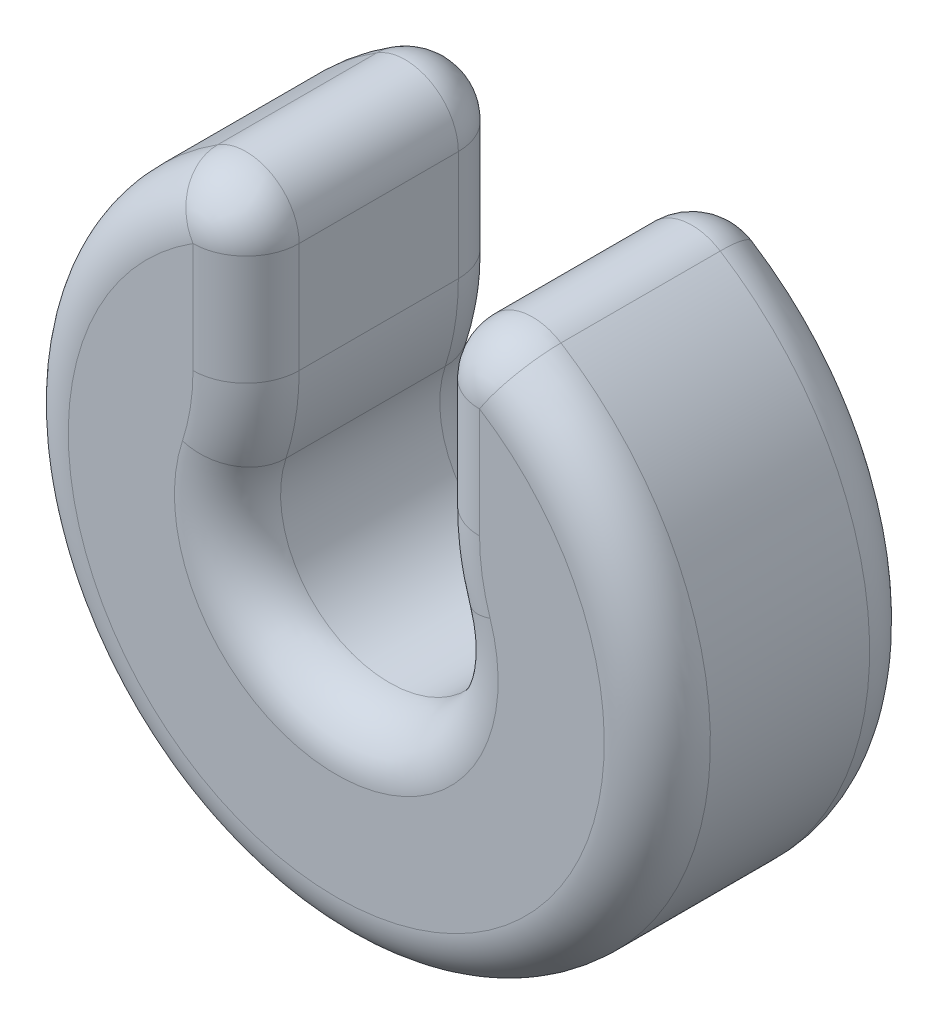
ISO-10303-21;
HEADER;
FILE_DESCRIPTION(('STEP AP214'),'2;1');
FILE_NAME('part.step','',(''),(''),'','','');
FILE_SCHEMA(('AUTOMOTIVE_DESIGN { 1 0 10303 214 1 1 1 1 }'));
ENDSEC;
DATA;
#1=APPLICATION_CONTEXT('core data for automotive mechanical design processes');
#2=APPLICATION_PROTOCOL_DEFINITION('international standard','automotive_design',2000,#1);
#3=PRODUCT_CONTEXT('',#1,'mechanical');
#4=PRODUCT('Part','Part','',(#3));
#5=PRODUCT_RELATED_PRODUCT_CATEGORY('part','',(#4));
#6=PRODUCT_DEFINITION_FORMATION('','',#4);
#7=PRODUCT_DEFINITION_CONTEXT('part definition',#1,'design');
#8=PRODUCT_DEFINITION('design','',#6,#7);
#9=PRODUCT_DEFINITION_SHAPE('','',#8);
#10=(LENGTH_UNIT() NAMED_UNIT(*) SI_UNIT(.MILLI.,.METRE.));
#11=(NAMED_UNIT(*) PLANE_ANGLE_UNIT() SI_UNIT($,.RADIAN.));
#12=(NAMED_UNIT(*) SI_UNIT($,.STERADIAN.) SOLID_ANGLE_UNIT());
#13=UNCERTAINTY_MEASURE_WITH_UNIT(LENGTH_MEASURE(1.E-05),#10,'distance_accuracy_value','');
#14=(GEOMETRIC_REPRESENTATION_CONTEXT(3) GLOBAL_UNCERTAINTY_ASSIGNED_CONTEXT((#13)) GLOBAL_UNIT_ASSIGNED_CONTEXT((#10,
#11,#12)) REPRESENTATION_CONTEXT('',''));
#15=CARTESIAN_POINT('',(0.,0.,0.));
#16=DIRECTION('',(0.,0.,1.));
#17=DIRECTION('',(1.,0.,0.));
#18=AXIS2_PLACEMENT_3D('',#15,#16,#17);
#19=CARTESIAN_POINT('',(0.,0.,5.));
#20=DIRECTION('',(0.,0.,-1.));
#21=DIRECTION('',(-1.,0.,0.));
#22=AXIS2_PLACEMENT_3D('',#19,#20,#21);
#23=CYLINDRICAL_SURFACE('',#22,6.05);
#24=DIRECTION('',(0.,0.,-1.));
#25=VECTOR('',#24,1.);
#26=CARTESIAN_POINT('',(-3.23465346534654,5.11268197320366,5.));
#27=LINE('',#26,#25);
#28=CARTESIAN_POINT('',(-3.23465346534654,5.11268197320366,4.));
#29=VERTEX_POINT('',#28);
#30=CARTESIAN_POINT('',(-3.23465346534654,5.11268197320366,1.));
#31=VERTEX_POINT('',#30);
#32=EDGE_CURVE('E245',#29,#31,#27,.T.);
#33=ORIENTED_EDGE('',*,*,#32,.T.);
#34=CARTESIAN_POINT('',(0.,0.,1.));
#35=DIRECTION('',(0.,0.,1.));
#36=DIRECTION('',(1.,0.,0.));
#37=AXIS2_PLACEMENT_3D('',#34,#35,#36);
#38=CIRCLE('',#37,6.05);
#39=CARTESIAN_POINT('',(3.23465346534654,5.11268197320366,1.));
#40=VERTEX_POINT('',#39);
#41=EDGE_CURVE('E11',#31,#40,#38,.T.);
#42=ORIENTED_EDGE('',*,*,#41,.T.);
#43=DIRECTION('',(0.,0.,-1.));
#44=VECTOR('',#43,1.);
#45=CARTESIAN_POINT('',(3.23465346534654,5.11268197320366,5.));
#46=LINE('',#45,#44);
#47=CARTESIAN_POINT('',(3.23465346534654,5.11268197320366,4.));
#48=VERTEX_POINT('',#47);
#49=EDGE_CURVE('E166',#40,#48,#46,.F.);
#50=ORIENTED_EDGE('',*,*,#49,.T.);
#51=CARTESIAN_POINT('',(0.,0.,4.));
#52=DIRECTION('',(0.,0.,1.));
#53=DIRECTION('',(1.,0.,0.));
#54=AXIS2_PLACEMENT_3D('',#51,#52,#53);
#55=CIRCLE('',#54,6.05);
#56=EDGE_CURVE('E50',#48,#29,#55,.F.);
#57=ORIENTED_EDGE('',*,*,#56,.T.);
#58=EDGE_LOOP('',(#33,#42,#50,#57));
#59=FACE_BOUND('',#58,.T.);
#60=ADVANCED_FACE('F41',(#59),#23,.T.);
#61=CARTESIAN_POINT('',(1.7,5.80624663616695,5.));
#62=DIRECTION('',(1.,0.,0.));
#63=DIRECTION('',(0.,1.,0.));
#64=AXIS2_PLACEMENT_3D('',#61,#62,#63);
#65=PLANE('',#64);
#66=DIRECTION('',(0.,0.,-1.));
#67=VECTOR('',#66,1.);
#68=CARTESIAN_POINT('',(1.7,4.26761057267413,5.));
#69=LINE('',#68,#67);
#70=CARTESIAN_POINT('',(1.7,4.26761057267413,4.));
#71=VERTEX_POINT('',#70);
#72=CARTESIAN_POINT('',(1.7,4.26761057267413,1.));
#73=VERTEX_POINT('',#72);
#74=EDGE_CURVE('E250',#71,#73,#69,.T.);
#75=ORIENTED_EDGE('',*,*,#74,.T.);
#76=DIRECTION('',(0.,-1.,0.));
#77=VECTOR('',#76,1.);
#78=CARTESIAN_POINT('',(1.7,5.80624663616695,1.));
#79=LINE('',#78,#77);
#80=CARTESIAN_POINT('',(1.7,2.19374109684803,1.));
#81=VERTEX_POINT('',#80);
#82=EDGE_CURVE('E288',#73,#81,#79,.T.);
#83=ORIENTED_EDGE('',*,*,#82,.T.);
#84=DIRECTION('',(0.,0.,-1.));
#85=VECTOR('',#84,1.);
#86=CARTESIAN_POINT('',(1.7,2.19374109684803,5.));
#87=LINE('',#86,#85);
#88=CARTESIAN_POINT('',(1.7,2.19374109684803,4.));
#89=VERTEX_POINT('',#88);
#90=EDGE_CURVE('E328',#81,#89,#87,.F.);
#91=ORIENTED_EDGE('',*,*,#90,.T.);
#92=DIRECTION('',(0.,-1.,0.));
#93=VECTOR('',#92,1.);
#94=CARTESIAN_POINT('',(1.7,4.26761057267413,4.));
#95=LINE('',#94,#93);
#96=EDGE_CURVE('E227',#89,#71,#95,.F.);
#97=ORIENTED_EDGE('',*,*,#96,.T.);
#98=EDGE_LOOP('',(#75,#83,#91,#97));
#99=FACE_BOUND('',#98,.T.);
#100=ADVANCED_FACE('F301',(#99),#65,.F.);
#101=CARTESIAN_POINT('',(0.,0.,5.));
#102=DIRECTION('',(0.,0.,-1.));
#103=DIRECTION('',(-1.,0.,0.));
#104=AXIS2_PLACEMENT_3D('',#101,#102,#103);
#105=CYLINDRICAL_SURFACE('',#104,2.05);
#106=DIRECTION('',(0.,0.,-1.));
#107=VECTOR('',#106,1.);
#108=CARTESIAN_POINT('',(1.94822695035461,0.63789634731042,5.));
#109=LINE('',#108,#107);
#110=CARTESIAN_POINT('',(1.94822695035461,0.63789634731042,4.));
#111=VERTEX_POINT('',#110);
#112=CARTESIAN_POINT('',(1.94822695035461,0.63789634731042,1.));
#113=VERTEX_POINT('',#112);
#114=EDGE_CURVE('E327',#111,#113,#109,.T.);
#115=ORIENTED_EDGE('',*,*,#114,.T.);
#116=CARTESIAN_POINT('',(0.,0.,1.));
#117=DIRECTION('',(0.,0.,1.));
#118=DIRECTION('',(1.,0.,0.));
#119=AXIS2_PLACEMENT_3D('',#116,#117,#118);
#120=CIRCLE('',#119,2.05);
#121=CARTESIAN_POINT('',(-1.94822695035461,0.63789634731042,1.));
#122=VERTEX_POINT('',#121);
#123=EDGE_CURVE('E282',#113,#122,#120,.F.);
#124=ORIENTED_EDGE('',*,*,#123,.T.);
#125=DIRECTION('',(0.,0.,-1.));
#126=VECTOR('',#125,1.);
#127=CARTESIAN_POINT('',(-1.94822695035461,0.63789634731042,5.));
#128=LINE('',#127,#126);
#129=CARTESIAN_POINT('',(-1.94822695035461,0.63789634731042,4.));
#130=VERTEX_POINT('',#129);
#131=EDGE_CURVE('E203',#122,#130,#128,.F.);
#132=ORIENTED_EDGE('',*,*,#131,.T.);
#133=CARTESIAN_POINT('',(0.,0.,4.));
#134=DIRECTION('',(0.,0.,1.));
#135=DIRECTION('',(1.,0.,0.));
#136=AXIS2_PLACEMENT_3D('',#133,#134,#135);
#137=CIRCLE('',#136,2.05);
#138=EDGE_CURVE('E280',#130,#111,#137,.T.);
#139=ORIENTED_EDGE('',*,*,#138,.T.);
#140=EDGE_LOOP('',(#115,#124,#132,#139));
#141=FACE_BOUND('',#140,.T.);
#142=ADVANCED_FACE('F330',(#141),#105,.F.);
#143=CARTESIAN_POINT('',(-1.7,5.80624663616695,5.));
#144=DIRECTION('',(-1.,0.,0.));
#145=DIRECTION('',(0.,-1.,0.));
#146=AXIS2_PLACEMENT_3D('',#143,#144,#145);
#147=PLANE('',#146);
#148=DIRECTION('',(0.,0.,-1.));
#149=VECTOR('',#148,1.);
#150=CARTESIAN_POINT('',(-1.7,2.19374109684803,5.));
#151=LINE('',#150,#149);
#152=CARTESIAN_POINT('',(-1.7,2.19374109684803,4.));
#153=VERTEX_POINT('',#152);
#154=CARTESIAN_POINT('',(-1.7,2.19374109684803,1.));
#155=VERTEX_POINT('',#154);
#156=EDGE_CURVE('E149',#153,#155,#151,.T.);
#157=ORIENTED_EDGE('',*,*,#156,.T.);
#158=DIRECTION('',(0.,1.,0.));
#159=VECTOR('',#158,1.);
#160=CARTESIAN_POINT('',(-1.7,5.80624663616695,1.));
#161=LINE('',#160,#159);
#162=CARTESIAN_POINT('',(-1.7,4.26761057267413,1.));
#163=VERTEX_POINT('',#162);
#164=EDGE_CURVE('E144',#155,#163,#161,.T.);
#165=ORIENTED_EDGE('',*,*,#164,.T.);
#166=DIRECTION('',(0.,0.,-1.));
#167=VECTOR('',#166,1.);
#168=CARTESIAN_POINT('',(-1.7,4.26761057267413,5.));
#169=LINE('',#168,#167);
#170=CARTESIAN_POINT('',(-1.7,4.26761057267413,4.));
#171=VERTEX_POINT('',#170);
#172=EDGE_CURVE('E147',#163,#171,#169,.F.);
#173=ORIENTED_EDGE('',*,*,#172,.T.);
#174=DIRECTION('',(0.,1.,0.));
#175=VECTOR('',#174,1.);
#176=CARTESIAN_POINT('',(-1.7,2.19374109684803,4.));
#177=LINE('',#176,#175);
#178=EDGE_CURVE('E154',#171,#153,#177,.F.);
#179=ORIENTED_EDGE('',*,*,#178,.T.);
#180=EDGE_LOOP('',(#157,#165,#173,#179));
#181=FACE_BOUND('',#180,.T.);
#182=ADVANCED_FACE('F146',(#181),#147,.F.);
#183=CARTESIAN_POINT('',(0.,0.,5.));
#184=DIRECTION('',(0.,0.,1.));
#185=DIRECTION('',(1.,0.,0.));
#186=AXIS2_PLACEMENT_3D('',#183,#184,#185);
#187=PLANE('',#186);
#188=CARTESIAN_POINT('',(-6.7,2.19374109684803,5.));
#189=DIRECTION('',(0.,0.,1.));
#190=DIRECTION('',(1.,0.,0.));
#191=AXIS2_PLACEMENT_3D('',#188,#189,#190);
#192=CIRCLE('',#191,4.);
#193=CARTESIAN_POINT('',(-2.89858156028369,0.949065297217942,5.));
#194=VERTEX_POINT('',#193);
#195=CARTESIAN_POINT('',(-2.7,2.19374109684803,5.));
#196=VERTEX_POINT('',#195);
#197=EDGE_CURVE('E58',#194,#196,#192,.T.);
#198=ORIENTED_EDGE('',*,*,#197,.T.);
#199=DIRECTION('',(0.,1.,0.));
#200=VECTOR('',#199,1.);
#201=CARTESIAN_POINT('',(-2.7,4.26761057267413,5.));
#202=LINE('',#201,#200);
#203=CARTESIAN_POINT('',(-2.7,4.26761057267413,5.));
#204=VERTEX_POINT('',#203);
#205=EDGE_CURVE('E241',#196,#204,#202,.T.);
#206=ORIENTED_EDGE('',*,*,#205,.T.);
#207=CARTESIAN_POINT('',(0.,0.,5.));
#208=DIRECTION('',(0.,0.,1.));
#209=DIRECTION('',(1.,0.,0.));
#210=AXIS2_PLACEMENT_3D('',#207,#208,#209);
#211=CIRCLE('',#210,5.05);
#212=CARTESIAN_POINT('',(2.7,4.26761057267413,5.));
#213=VERTEX_POINT('',#212);
#214=EDGE_CURVE('E236',#204,#213,#211,.T.);
#215=ORIENTED_EDGE('',*,*,#214,.T.);
#216=DIRECTION('',(0.,-1.,0.));
#217=VECTOR('',#216,1.);
#218=CARTESIAN_POINT('',(2.7,2.19374109684803,5.));
#219=LINE('',#218,#217);
#220=CARTESIAN_POINT('',(2.7,2.19374109684803,5.));
#221=VERTEX_POINT('',#220);
#222=EDGE_CURVE('E226',#213,#221,#219,.T.);
#223=ORIENTED_EDGE('',*,*,#222,.T.);
#224=CARTESIAN_POINT('',(6.7,2.19374109684803,5.));
#225=DIRECTION('',(0.,0.,1.));
#226=DIRECTION('',(1.,0.,0.));
#227=AXIS2_PLACEMENT_3D('',#224,#225,#226);
#228=CIRCLE('',#227,4.);
#229=CARTESIAN_POINT('',(2.89858156028369,0.949065297217942,5.));
#230=VERTEX_POINT('',#229);
#231=EDGE_CURVE('E233',#221,#230,#228,.T.);
#232=ORIENTED_EDGE('',*,*,#231,.T.);
#233=CARTESIAN_POINT('',(0.,0.,5.));
#234=DIRECTION('',(0.,0.,1.));
#235=DIRECTION('',(1.,0.,0.));
#236=AXIS2_PLACEMENT_3D('',#233,#234,#235);
#237=CIRCLE('',#236,3.05);
#238=EDGE_CURVE('E63',#230,#194,#237,.F.);
#239=ORIENTED_EDGE('',*,*,#238,.T.);
#240=EDGE_LOOP('',(#198,#206,#215,#223,#232,#239));
#241=FACE_BOUND('',#240,.T.);
#242=ADVANCED_FACE('F261',(#241),#187,.T.);
#243=CARTESIAN_POINT('',(0.,0.,0.));
#244=DIRECTION('',(0.,0.,1.));
#245=DIRECTION('',(1.,0.,0.));
#246=AXIS2_PLACEMENT_3D('',#243,#244,#245);
#247=PLANE('',#246);
#248=CARTESIAN_POINT('',(0.,0.,0.));
#249=DIRECTION('',(0.,0.,1.));
#250=DIRECTION('',(1.,0.,0.));
#251=AXIS2_PLACEMENT_3D('',#248,#249,#250);
#252=CIRCLE('',#251,5.05);
#253=CARTESIAN_POINT('',(2.7,4.26761057267413,0.));
#254=VERTEX_POINT('',#253);
#255=CARTESIAN_POINT('',(-2.7,4.26761057267413,0.));
#256=VERTEX_POINT('',#255);
#257=EDGE_CURVE('E153',#254,#256,#252,.F.);
#258=ORIENTED_EDGE('',*,*,#257,.T.);
#259=DIRECTION('',(0.,1.,0.));
#260=VECTOR('',#259,1.);
#261=CARTESIAN_POINT('',(-2.7,0.,0.));
#262=LINE('',#261,#260);
#263=CARTESIAN_POINT('',(-2.7,2.19374109684803,0.));
#264=VERTEX_POINT('',#263);
#265=EDGE_CURVE('E179',#256,#264,#262,.F.);
#266=ORIENTED_EDGE('',*,*,#265,.T.);
#267=CARTESIAN_POINT('',(-6.7,2.19374109684803,0.));
#268=DIRECTION('',(0.,0.,1.));
#269=DIRECTION('',(1.,0.,0.));
#270=AXIS2_PLACEMENT_3D('',#267,#268,#269);
#271=CIRCLE('',#270,4.);
#272=CARTESIAN_POINT('',(-2.89858156028369,0.949065297217942,0.));
#273=VERTEX_POINT('',#272);
#274=EDGE_CURVE('E273',#264,#273,#271,.F.);
#275=ORIENTED_EDGE('',*,*,#274,.T.);
#276=CARTESIAN_POINT('',(0.,0.,0.));
#277=DIRECTION('',(0.,0.,1.));
#278=DIRECTION('',(1.,0.,0.));
#279=AXIS2_PLACEMENT_3D('',#276,#277,#278);
#280=CIRCLE('',#279,3.05);
#281=CARTESIAN_POINT('',(2.89858156028369,0.949065297217942,0.));
#282=VERTEX_POINT('',#281);
#283=EDGE_CURVE('E271',#273,#282,#280,.T.);
#284=ORIENTED_EDGE('',*,*,#283,.T.);
#285=CARTESIAN_POINT('',(6.7,2.19374109684803,0.));
#286=DIRECTION('',(0.,0.,1.));
#287=DIRECTION('',(1.,0.,0.));
#288=AXIS2_PLACEMENT_3D('',#285,#286,#287);
#289=CIRCLE('',#288,4.);
#290=CARTESIAN_POINT('',(2.7,2.19374109684803,0.));
#291=VERTEX_POINT('',#290);
#292=EDGE_CURVE('E269',#282,#291,#289,.F.);
#293=ORIENTED_EDGE('',*,*,#292,.T.);
#294=DIRECTION('',(0.,-1.,0.));
#295=VECTOR('',#294,1.);
#296=CARTESIAN_POINT('',(2.7,0.,0.));
#297=LINE('',#296,#295);
#298=EDGE_CURVE('E267',#291,#254,#297,.F.);
#299=ORIENTED_EDGE('',*,*,#298,.T.);
#300=EDGE_LOOP('',(#258,#266,#275,#284,#293,#299));
#301=FACE_BOUND('',#300,.T.);
#302=ADVANCED_FACE('F315',(#301),#247,.F.);
#303=CARTESIAN_POINT('',(6.7,2.19374109684803,5.));
#304=DIRECTION('',(0.,0.,-1.));
#305=DIRECTION('',(-1.,0.,0.));
#306=AXIS2_PLACEMENT_3D('',#303,#304,#305);
#307=CYLINDRICAL_SURFACE('',#306,5.);
#308=ORIENTED_EDGE('',*,*,#90,.F.);
#309=CARTESIAN_POINT('',(6.7,2.19374109684803,1.));
#310=DIRECTION('',(0.,0.,1.));
#311=DIRECTION('',(1.,0.,0.));
#312=AXIS2_PLACEMENT_3D('',#309,#310,#311);
#313=CIRCLE('',#312,5.);
#314=EDGE_CURVE('E285',#81,#113,#313,.T.);
#315=ORIENTED_EDGE('',*,*,#314,.T.);
#316=ORIENTED_EDGE('',*,*,#114,.F.);
#317=CARTESIAN_POINT('',(6.7,2.19374109684803,4.));
#318=DIRECTION('',(0.,0.,1.));
#319=DIRECTION('',(1.,0.,0.));
#320=AXIS2_PLACEMENT_3D('',#317,#318,#319);
#321=CIRCLE('',#320,5.);
#322=EDGE_CURVE('E232',#111,#89,#321,.F.);
#323=ORIENTED_EDGE('',*,*,#322,.T.);
#324=EDGE_LOOP('',(#308,#315,#316,#323));
#325=FACE_BOUND('',#324,.T.);
#326=ADVANCED_FACE('F326',(#325),#307,.T.);
#327=CARTESIAN_POINT('',(-6.7,2.19374109684803,5.));
#328=DIRECTION('',(0.,0.,-1.));
#329=DIRECTION('',(-1.,0.,0.));
#330=AXIS2_PLACEMENT_3D('',#327,#328,#329);
#331=CYLINDRICAL_SURFACE('',#330,5.);
#332=ORIENTED_EDGE('',*,*,#131,.F.);
#333=CARTESIAN_POINT('',(-6.7,2.19374109684803,1.));
#334=DIRECTION('',(0.,0.,1.));
#335=DIRECTION('',(1.,0.,0.));
#336=AXIS2_PLACEMENT_3D('',#333,#334,#335);
#337=CIRCLE('',#336,5.);
#338=EDGE_CURVE('E278',#122,#155,#337,.T.);
#339=ORIENTED_EDGE('',*,*,#338,.T.);
#340=ORIENTED_EDGE('',*,*,#156,.F.);
#341=CARTESIAN_POINT('',(-6.7,2.19374109684803,4.));
#342=DIRECTION('',(0.,0.,1.));
#343=DIRECTION('',(1.,0.,0.));
#344=AXIS2_PLACEMENT_3D('',#341,#342,#343);
#345=CIRCLE('',#344,5.);
#346=EDGE_CURVE('E276',#153,#130,#345,.F.);
#347=ORIENTED_EDGE('',*,*,#346,.T.);
#348=EDGE_LOOP('',(#332,#339,#340,#347));
#349=FACE_BOUND('',#348,.T.);
#350=ADVANCED_FACE('F346',(#349),#331,.T.);
#351=CARTESIAN_POINT('',(2.7,4.26761057267413,5.));
#352=DIRECTION('',(0.,0.,-1.));
#353=DIRECTION('',(-1.,0.,0.));
#354=AXIS2_PLACEMENT_3D('',#351,#352,#353);
#355=CYLINDRICAL_SURFACE('',#354,1.);
#356=ORIENTED_EDGE('',*,*,#49,.F.);
#357=CARTESIAN_POINT('',(2.7,4.26761057267413,1.));
#358=DIRECTION('',(0.,0.,-1.));
#359=DIRECTION('',(-1.,0.,0.));
#360=AXIS2_PLACEMENT_3D('',#357,#358,#359);
#361=CIRCLE('',#360,1.);
#362=EDGE_CURVE('E259',#40,#73,#361,.F.);
#363=ORIENTED_EDGE('',*,*,#362,.T.);
#364=ORIENTED_EDGE('',*,*,#74,.F.);
#365=CARTESIAN_POINT('',(2.7,4.26761057267413,4.));
#366=DIRECTION('',(0.,0.,-1.));
#367=DIRECTION('',(-1.,0.,0.));
#368=AXIS2_PLACEMENT_3D('',#365,#366,#367);
#369=CIRCLE('',#368,1.);
#370=EDGE_CURVE('E290',#71,#48,#369,.T.);
#371=ORIENTED_EDGE('',*,*,#370,.T.);
#372=EDGE_LOOP('',(#356,#363,#364,#371));
#373=FACE_BOUND('',#372,.T.);
#374=ADVANCED_FACE('F296',(#373),#355,.T.);
#375=CARTESIAN_POINT('',(-2.7,4.26761057267413,5.));
#376=DIRECTION('',(0.,0.,-1.));
#377=DIRECTION('',(-1.,0.,0.));
#378=AXIS2_PLACEMENT_3D('',#375,#376,#377);
#379=CYLINDRICAL_SURFACE('',#378,1.);
#380=ORIENTED_EDGE('',*,*,#172,.F.);
#381=CARTESIAN_POINT('',(-2.7,4.26761057267413,1.));
#382=DIRECTION('',(0.,0.,-1.));
#383=DIRECTION('',(-1.,0.,0.));
#384=AXIS2_PLACEMENT_3D('',#381,#382,#383);
#385=CIRCLE('',#384,1.);
#386=EDGE_CURVE('E162',#163,#31,#385,.F.);
#387=ORIENTED_EDGE('',*,*,#386,.T.);
#388=ORIENTED_EDGE('',*,*,#32,.F.);
#389=CARTESIAN_POINT('',(-2.7,4.26761057267413,4.));
#390=DIRECTION('',(0.,0.,-1.));
#391=DIRECTION('',(-1.,0.,0.));
#392=AXIS2_PLACEMENT_3D('',#389,#390,#391);
#393=CIRCLE('',#392,1.);
#394=EDGE_CURVE('E165',#29,#171,#393,.T.);
#395=ORIENTED_EDGE('',*,*,#394,.T.);
#396=EDGE_LOOP('',(#380,#387,#388,#395));
#397=FACE_BOUND('',#396,.T.);
#398=ADVANCED_FACE('F160',(#397),#379,.T.);
#399=CARTESIAN_POINT('',(6.7,2.19374109684803,1.));
#400=DIRECTION('',(0.,0.,1.));
#401=DIRECTION('',(1.,0.,0.));
#402=AXIS2_PLACEMENT_3D('',#399,#400,#401);
#403=TOROIDAL_SURFACE('',#402,4.,1.);
#404=CARTESIAN_POINT('',(2.89858156028369,0.949065297217942,1.));
#405=DIRECTION('',(0.311168949907522,-0.950354609929078,0.));
#406=DIRECTION('',(0.950354609929078,0.311168949907522,0.));
#407=AXIS2_PLACEMENT_3D('',#404,#405,#406);
#408=CIRCLE('',#407,1.);
#409=EDGE_CURVE('E197',#113,#282,#408,.T.);
#410=ORIENTED_EDGE('',*,*,#409,.F.);
#411=ORIENTED_EDGE('',*,*,#314,.F.);
#412=CARTESIAN_POINT('',(2.7,2.19374109684803,1.));
#413=DIRECTION('',(0.,1.,0.));
#414=DIRECTION('',(0.,0.,1.));
#415=AXIS2_PLACEMENT_3D('',#412,#413,#414);
#416=CIRCLE('',#415,1.);
#417=EDGE_CURVE('E200',#291,#81,#416,.T.);
#418=ORIENTED_EDGE('',*,*,#417,.F.);
#419=ORIENTED_EDGE('',*,*,#292,.F.);
#420=EDGE_LOOP('',(#410,#411,#418,#419));
#421=FACE_BOUND('',#420,.T.);
#422=ADVANCED_FACE('F321',(#421),#403,.T.);
#423=CARTESIAN_POINT('',(2.7,5.80624663616695,1.));
#424=DIRECTION('',(0.,-1.,0.));
#425=DIRECTION('',(1.,0.,0.));
#426=AXIS2_PLACEMENT_3D('',#423,#424,#425);
#427=CYLINDRICAL_SURFACE('',#426,1.);
#428=ORIENTED_EDGE('',*,*,#417,.T.);
#429=ORIENTED_EDGE('',*,*,#82,.F.);
#430=CARTESIAN_POINT('',(2.7,4.26761057267413,1.));
#431=DIRECTION('',(0.,1.,0.));
#432=DIRECTION('',(0.,0.,1.));
#433=AXIS2_PLACEMENT_3D('',#430,#431,#432);
#434=CIRCLE('',#433,1.);
#435=EDGE_CURVE('E194',#254,#73,#434,.T.);
#436=ORIENTED_EDGE('',*,*,#435,.F.);
#437=ORIENTED_EDGE('',*,*,#298,.F.);
#438=EDGE_LOOP('',(#428,#429,#436,#437));
#439=FACE_BOUND('',#438,.T.);
#440=ADVANCED_FACE('F307',(#439),#427,.T.);
#441=CARTESIAN_POINT('',(0.,0.,1.));
#442=DIRECTION('',(0.,0.,1.));
#443=DIRECTION('',(1.,0.,0.));
#444=AXIS2_PLACEMENT_3D('',#441,#442,#443);
#445=TOROIDAL_SURFACE('',#444,3.05,1.);
#446=ORIENTED_EDGE('',*,*,#409,.T.);
#447=ORIENTED_EDGE('',*,*,#283,.F.);
#448=CARTESIAN_POINT('',(-2.89858156028369,0.949065297217942,1.));
#449=DIRECTION('',(0.311168949907522,0.950354609929078,0.));
#450=DIRECTION('',(-0.950354609929078,0.311168949907522,0.));
#451=AXIS2_PLACEMENT_3D('',#448,#449,#450);
#452=CIRCLE('',#451,1.);
#453=EDGE_CURVE('E191',#122,#273,#452,.T.);
#454=ORIENTED_EDGE('',*,*,#453,.F.);
#455=ORIENTED_EDGE('',*,*,#123,.F.);
#456=EDGE_LOOP('',(#446,#447,#454,#455));
#457=FACE_BOUND('',#456,.T.);
#458=ADVANCED_FACE('F352',(#457),#445,.T.);
#459=CARTESIAN_POINT('',(2.7,4.26761057267413,1.));
#460=DIRECTION('',(0.,0.,1.));
#461=DIRECTION('',(1.,0.,0.));
#462=AXIS2_PLACEMENT_3D('',#459,#460,#461);
#463=SPHERICAL_SURFACE('',#462,1.);
#464=ORIENTED_EDGE('',*,*,#435,.T.);
#465=ORIENTED_EDGE('',*,*,#362,.F.);
#466=CARTESIAN_POINT('',(2.7,4.26761057267413,1.));
#467=DIRECTION('',(0.84507140052953,-0.534653465346535,0.));
#468=DIRECTION('',(0.534653465346535,0.84507140052953,0.));
#469=AXIS2_PLACEMENT_3D('',#466,#467,#468);
#470=CIRCLE('',#469,1.);
#471=EDGE_CURVE('E188',#254,#40,#470,.T.);
#472=ORIENTED_EDGE('',*,*,#471,.F.);
#473=EDGE_LOOP('',(#464,#465,#472));
#474=FACE_BOUND('',#473,.T.);
#475=ADVANCED_FACE('F310',(#474),#463,.T.);
#476=CARTESIAN_POINT('',(-6.7,2.19374109684803,1.));
#477=DIRECTION('',(0.,0.,1.));
#478=DIRECTION('',(1.,0.,0.));
#479=AXIS2_PLACEMENT_3D('',#476,#477,#478);
#480=TOROIDAL_SURFACE('',#479,4.,1.);
#481=ORIENTED_EDGE('',*,*,#453,.T.);
#482=ORIENTED_EDGE('',*,*,#274,.F.);
#483=CARTESIAN_POINT('',(-2.7,2.19374109684803,1.));
#484=DIRECTION('',(0.,1.,0.));
#485=DIRECTION('',(0.,0.,1.));
#486=AXIS2_PLACEMENT_3D('',#483,#484,#485);
#487=CIRCLE('',#486,1.);
#488=EDGE_CURVE('E181',#155,#264,#487,.T.);
#489=ORIENTED_EDGE('',*,*,#488,.F.);
#490=ORIENTED_EDGE('',*,*,#338,.F.);
#491=EDGE_LOOP('',(#481,#482,#489,#490));
#492=FACE_BOUND('',#491,.T.);
#493=ADVANCED_FACE('F349',(#492),#480,.T.);
#494=CARTESIAN_POINT('',(0.,0.,1.));
#495=DIRECTION('',(0.,0.,1.));
#496=DIRECTION('',(1.,0.,0.));
#497=AXIS2_PLACEMENT_3D('',#494,#495,#496);
#498=TOROIDAL_SURFACE('',#497,5.05,1.);
#499=ORIENTED_EDGE('',*,*,#471,.T.);
#500=ORIENTED_EDGE('',*,*,#41,.F.);
#501=CARTESIAN_POINT('',(-2.7,4.26761057267413,1.));
#502=DIRECTION('',(0.84507140052953,0.534653465346535,0.));
#503=DIRECTION('',(-0.534653465346535,0.84507140052953,0.));
#504=AXIS2_PLACEMENT_3D('',#501,#502,#503);
#505=CIRCLE('',#504,1.);
#506=EDGE_CURVE('E173',#256,#31,#505,.T.);
#507=ORIENTED_EDGE('',*,*,#506,.F.);
#508=ORIENTED_EDGE('',*,*,#257,.F.);
#509=EDGE_LOOP('',(#499,#500,#507,#508));
#510=FACE_BOUND('',#509,.T.);
#511=ADVANCED_FACE('F313',(#510),#498,.T.);
#512=CARTESIAN_POINT('',(-2.7,5.80624663616695,1.));
#513=DIRECTION('',(0.,1.,0.));
#514=DIRECTION('',(-1.,0.,0.));
#515=AXIS2_PLACEMENT_3D('',#512,#513,#514);
#516=CYLINDRICAL_SURFACE('',#515,1.);
#517=ORIENTED_EDGE('',*,*,#488,.T.);
#518=ORIENTED_EDGE('',*,*,#265,.F.);
#519=CARTESIAN_POINT('',(-2.7,4.26761057267413,1.));
#520=DIRECTION('',(0.,1.,0.));
#521=DIRECTION('',(0.,0.,1.));
#522=AXIS2_PLACEMENT_3D('',#519,#520,#521);
#523=CIRCLE('',#522,1.);
#524=EDGE_CURVE('E171',#163,#256,#523,.T.);
#525=ORIENTED_EDGE('',*,*,#524,.F.);
#526=ORIENTED_EDGE('',*,*,#164,.F.);
#527=EDGE_LOOP('',(#517,#518,#525,#526));
#528=FACE_BOUND('',#527,.T.);
#529=ADVANCED_FACE('F177',(#528),#516,.T.);
#530=CARTESIAN_POINT('',(-2.7,4.26761057267413,1.));
#531=DIRECTION('',(0.,0.,1.));
#532=DIRECTION('',(1.,0.,0.));
#533=AXIS2_PLACEMENT_3D('',#530,#531,#532);
#534=SPHERICAL_SURFACE('',#533,1.);
#535=ORIENTED_EDGE('',*,*,#506,.T.);
#536=ORIENTED_EDGE('',*,*,#386,.F.);
#537=ORIENTED_EDGE('',*,*,#524,.T.);
#538=EDGE_LOOP('',(#535,#536,#537));
#539=FACE_BOUND('',#538,.T.);
#540=ADVANCED_FACE('F170',(#539),#534,.T.);
#541=CARTESIAN_POINT('',(6.7,2.19374109684803,4.));
#542=DIRECTION('',(0.,0.,1.));
#543=DIRECTION('',(1.,0.,0.));
#544=AXIS2_PLACEMENT_3D('',#541,#542,#543);
#545=TOROIDAL_SURFACE('',#544,4.,1.);
#546=CARTESIAN_POINT('',(2.7,2.19374109684803,4.));
#547=DIRECTION('',(0.,1.,0.));
#548=DIRECTION('',(0.,0.,1.));
#549=AXIS2_PLACEMENT_3D('',#546,#547,#548);
#550=CIRCLE('',#549,1.);
#551=EDGE_CURVE('E184',#89,#221,#550,.T.);
#552=ORIENTED_EDGE('',*,*,#551,.F.);
#553=ORIENTED_EDGE('',*,*,#322,.F.);
#554=CARTESIAN_POINT('',(2.89858156028369,0.949065297217942,4.));
#555=DIRECTION('',(0.311168949907522,-0.950354609929078,0.));
#556=DIRECTION('',(0.950354609929078,0.311168949907522,0.));
#557=AXIS2_PLACEMENT_3D('',#554,#555,#556);
#558=CIRCLE('',#557,1.);
#559=EDGE_CURVE('E45',#230,#111,#558,.T.);
#560=ORIENTED_EDGE('',*,*,#559,.F.);
#561=ORIENTED_EDGE('',*,*,#231,.F.);
#562=EDGE_LOOP('',(#552,#553,#560,#561));
#563=FACE_BOUND('',#562,.T.);
#564=ADVANCED_FACE('F43',(#563),#545,.T.);
#565=CARTESIAN_POINT('',(0.,0.,4.));
#566=DIRECTION('',(0.,0.,1.));
#567=DIRECTION('',(1.,0.,0.));
#568=AXIS2_PLACEMENT_3D('',#565,#566,#567);
#569=TOROIDAL_SURFACE('',#568,3.05,1.);
#570=ORIENTED_EDGE('',*,*,#559,.T.);
#571=ORIENTED_EDGE('',*,*,#138,.F.);
#572=CARTESIAN_POINT('',(-2.89858156028369,0.949065297217942,4.));
#573=DIRECTION('',(0.311168949907522,0.950354609929078,0.));
#574=DIRECTION('',(-0.950354609929078,0.311168949907522,0.));
#575=AXIS2_PLACEMENT_3D('',#572,#573,#574);
#576=CIRCLE('',#575,1.);
#577=EDGE_CURVE('E217',#194,#130,#576,.T.);
#578=ORIENTED_EDGE('',*,*,#577,.F.);
#579=ORIENTED_EDGE('',*,*,#238,.F.);
#580=EDGE_LOOP('',(#570,#571,#578,#579));
#581=FACE_BOUND('',#580,.T.);
#582=ADVANCED_FACE('F342',(#581),#569,.T.);
#583=CARTESIAN_POINT('',(2.7,0.,4.));
#584=DIRECTION('',(0.,1.,0.));
#585=DIRECTION('',(-1.,0.,0.));
#586=AXIS2_PLACEMENT_3D('',#583,#584,#585);
#587=CYLINDRICAL_SURFACE('',#586,1.);
#588=ORIENTED_EDGE('',*,*,#551,.T.);
#589=ORIENTED_EDGE('',*,*,#222,.F.);
#590=CARTESIAN_POINT('',(2.7,4.26761057267413,4.));
#591=DIRECTION('',(0.,1.,0.));
#592=DIRECTION('',(0.,0.,1.));
#593=AXIS2_PLACEMENT_3D('',#590,#591,#592);
#594=CIRCLE('',#593,1.);
#595=EDGE_CURVE('E214',#71,#213,#594,.T.);
#596=ORIENTED_EDGE('',*,*,#595,.F.);
#597=ORIENTED_EDGE('',*,*,#96,.F.);
#598=EDGE_LOOP('',(#588,#589,#596,#597));
#599=FACE_BOUND('',#598,.T.);
#600=ADVANCED_FACE('F224',(#599),#587,.T.);
#601=CARTESIAN_POINT('',(-6.7,2.19374109684803,4.));
#602=DIRECTION('',(0.,0.,1.));
#603=DIRECTION('',(1.,0.,0.));
#604=AXIS2_PLACEMENT_3D('',#601,#602,#603);
#605=TOROIDAL_SURFACE('',#604,4.,1.);
#606=ORIENTED_EDGE('',*,*,#577,.T.);
#607=ORIENTED_EDGE('',*,*,#346,.F.);
#608=CARTESIAN_POINT('',(-2.7,2.19374109684803,4.));
#609=DIRECTION('',(0.,1.,0.));
#610=DIRECTION('',(0.,0.,1.));
#611=AXIS2_PLACEMENT_3D('',#608,#609,#610);
#612=CIRCLE('',#611,1.);
#613=EDGE_CURVE('E211',#196,#153,#612,.T.);
#614=ORIENTED_EDGE('',*,*,#613,.F.);
#615=ORIENTED_EDGE('',*,*,#197,.F.);
#616=EDGE_LOOP('',(#606,#607,#614,#615));
#617=FACE_BOUND('',#616,.T.);
#618=ADVANCED_FACE('F345',(#617),#605,.T.);
#619=CARTESIAN_POINT('',(2.7,4.26761057267413,4.));
#620=DIRECTION('',(0.,0.,1.));
#621=DIRECTION('',(1.,0.,0.));
#622=AXIS2_PLACEMENT_3D('',#619,#620,#621);
#623=SPHERICAL_SURFACE('',#622,1.);
#624=ORIENTED_EDGE('',*,*,#370,.F.);
#625=ORIENTED_EDGE('',*,*,#595,.T.);
#626=CARTESIAN_POINT('',(2.7,4.26761057267413,4.));
#627=DIRECTION('',(0.84507140052953,-0.534653465346535,0.));
#628=DIRECTION('',(0.534653465346535,0.84507140052953,0.));
#629=AXIS2_PLACEMENT_3D('',#626,#627,#628);
#630=CIRCLE('',#629,1.);
#631=EDGE_CURVE('E208',#48,#213,#630,.T.);
#632=ORIENTED_EDGE('',*,*,#631,.F.);
#633=EDGE_LOOP('',(#624,#625,#632));
#634=FACE_BOUND('',#633,.T.);
#635=ADVANCED_FACE('F429',(#634),#623,.T.);
#636=CARTESIAN_POINT('',(-2.7,0.,4.));
#637=DIRECTION('',(0.,-1.,0.));
#638=DIRECTION('',(1.,0.,0.));
#639=AXIS2_PLACEMENT_3D('',#636,#637,#638);
#640=CYLINDRICAL_SURFACE('',#639,1.);
#641=ORIENTED_EDGE('',*,*,#613,.T.);
#642=ORIENTED_EDGE('',*,*,#178,.F.);
#643=CARTESIAN_POINT('',(-2.7,4.26761057267413,4.));
#644=DIRECTION('',(0.,1.,0.));
#645=DIRECTION('',(0.,0.,1.));
#646=AXIS2_PLACEMENT_3D('',#643,#644,#645);
#647=CIRCLE('',#646,1.);
#648=EDGE_CURVE('E206',#204,#171,#647,.T.);
#649=ORIENTED_EDGE('',*,*,#648,.F.);
#650=ORIENTED_EDGE('',*,*,#205,.F.);
#651=EDGE_LOOP('',(#641,#642,#649,#650));
#652=FACE_BOUND('',#651,.T.);
#653=ADVANCED_FACE('F263',(#652),#640,.T.);
#654=CARTESIAN_POINT('',(0.,0.,4.));
#655=DIRECTION('',(0.,0.,1.));
#656=DIRECTION('',(1.,0.,0.));
#657=AXIS2_PLACEMENT_3D('',#654,#655,#656);
#658=TOROIDAL_SURFACE('',#657,5.05,1.);
#659=ORIENTED_EDGE('',*,*,#631,.T.);
#660=ORIENTED_EDGE('',*,*,#214,.F.);
#661=CARTESIAN_POINT('',(-2.7,4.26761057267413,4.));
#662=DIRECTION('',(0.84507140052953,0.534653465346535,0.));
#663=DIRECTION('',(-0.534653465346535,0.84507140052953,0.));
#664=AXIS2_PLACEMENT_3D('',#661,#662,#663);
#665=CIRCLE('',#664,1.);
#666=EDGE_CURVE('E204',#29,#204,#665,.T.);
#667=ORIENTED_EDGE('',*,*,#666,.F.);
#668=ORIENTED_EDGE('',*,*,#56,.F.);
#669=EDGE_LOOP('',(#659,#660,#667,#668));
#670=FACE_BOUND('',#669,.T.);
#671=ADVANCED_FACE('F258',(#670),#658,.T.);
#672=CARTESIAN_POINT('',(-2.7,4.26761057267413,4.));
#673=DIRECTION('',(0.,0.,1.));
#674=DIRECTION('',(1.,0.,0.));
#675=AXIS2_PLACEMENT_3D('',#672,#673,#674);
#676=SPHERICAL_SURFACE('',#675,1.);
#677=ORIENTED_EDGE('',*,*,#648,.T.);
#678=ORIENTED_EDGE('',*,*,#394,.F.);
#679=ORIENTED_EDGE('',*,*,#666,.T.);
#680=EDGE_LOOP('',(#677,#678,#679));
#681=FACE_BOUND('',#680,.T.);
#682=ADVANCED_FACE('F253',(#681),#676,.T.);
#683=CLOSED_SHELL('',(#60,#100,#142,#182,#242,#302,#326,#350,#374,#398,#422,#440,#458,#475,#493,
#511,#529,#540,#564,#582,#600,#618,#635,#653,#671,#682));
#684=MANIFOLD_SOLID_BREP('B2',#683);
#685=ADVANCED_BREP_SHAPE_REPRESENTATION('',(#18,#684),#14);
#686=SHAPE_DEFINITION_REPRESENTATION(#9,#685);
ENDSEC;
END-ISO-10303-21;
